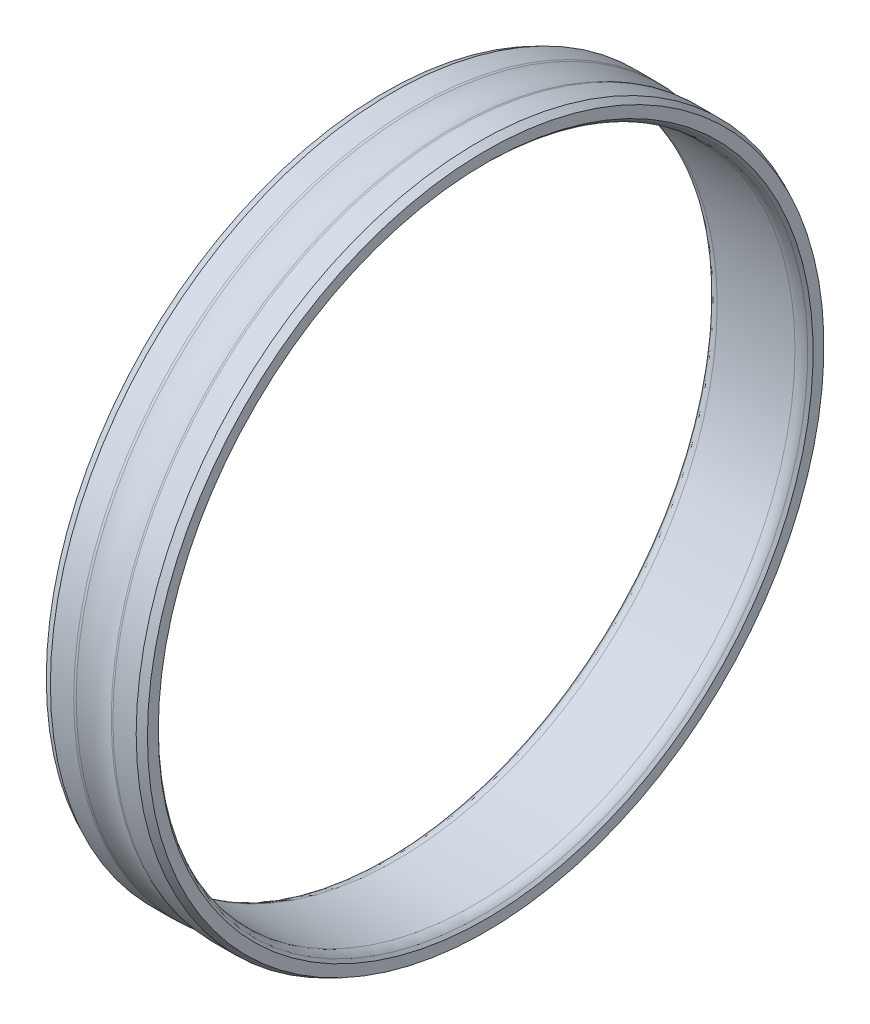
ISO-10303-21;
HEADER;
FILE_DESCRIPTION(('STEP AP214'),'2;1');
FILE_NAME('part.step','',(''),(''),'','','');
FILE_SCHEMA(('AUTOMOTIVE_DESIGN { 1 0 10303 214 1 1 1 1 }'));
ENDSEC;
DATA;
#1=APPLICATION_CONTEXT('core data for automotive mechanical design processes');
#2=APPLICATION_PROTOCOL_DEFINITION('international standard','automotive_design',2000,#1);
#3=PRODUCT_CONTEXT('',#1,'mechanical');
#4=PRODUCT('Part','Part','',(#3));
#5=PRODUCT_RELATED_PRODUCT_CATEGORY('part','',(#4));
#6=PRODUCT_DEFINITION_FORMATION('','',#4);
#7=PRODUCT_DEFINITION_CONTEXT('part definition',#1,'design');
#8=PRODUCT_DEFINITION('design','',#6,#7);
#9=PRODUCT_DEFINITION_SHAPE('','',#8);
#10=(LENGTH_UNIT() NAMED_UNIT(*) SI_UNIT(.MILLI.,.METRE.));
#11=(NAMED_UNIT(*) PLANE_ANGLE_UNIT() SI_UNIT($,.RADIAN.));
#12=(NAMED_UNIT(*) SI_UNIT($,.STERADIAN.) SOLID_ANGLE_UNIT());
#13=UNCERTAINTY_MEASURE_WITH_UNIT(LENGTH_MEASURE(1.E-05),#10,'distance_accuracy_value','');
#14=(GEOMETRIC_REPRESENTATION_CONTEXT(3) GLOBAL_UNCERTAINTY_ASSIGNED_CONTEXT((#13)) GLOBAL_UNIT_ASSIGNED_CONTEXT((#10,
#11,#12)) REPRESENTATION_CONTEXT('',''));
#15=CARTESIAN_POINT('',(0.,0.,0.));
#16=DIRECTION('',(0.,0.,1.));
#17=DIRECTION('',(1.,0.,0.));
#18=AXIS2_PLACEMENT_3D('',#15,#16,#17);
#19=CARTESIAN_POINT('',(1.51789321881345,0.,0.));
#20=DIRECTION('',(-1.,0.,0.));
#21=DIRECTION('',(0.,0.,1.));
#22=AXIS2_PLACEMENT_3D('',#19,#20,#21);
#23=TOROIDAL_SURFACE('',#22,13.035,0.5);
#24=CARTESIAN_POINT('',(1.87144660940672,0.,0.));
#25=DIRECTION('',(-1.,0.,0.));
#26=DIRECTION('',(0.,0.,1.));
#27=AXIS2_PLACEMENT_3D('',#24,#25,#26);
#28=CIRCLE('',#27,12.6814466094067);
#29=CARTESIAN_POINT('',(1.87144660940672,0.,12.6814466094067));
#30=VERTEX_POINT('',#29);
#31=EDGE_CURVE('E11',#30,#30,#28,.T.);
#32=ORIENTED_EDGE('',*,*,#31,.F.);
#33=EDGE_LOOP('',(#32));
#34=FACE_BOUND('',#33,.T.);
#35=CARTESIAN_POINT('',(1.51789321881345,0.,0.));
#36=DIRECTION('',(-1.,0.,0.));
#37=DIRECTION('',(0.,0.,1.));
#38=AXIS2_PLACEMENT_3D('',#35,#36,#37);
#39=CIRCLE('',#38,12.535);
#40=CARTESIAN_POINT('',(1.51789321881345,0.,12.535));
#41=VERTEX_POINT('',#40);
#42=EDGE_CURVE('E122',#41,#41,#39,.T.);
#43=ORIENTED_EDGE('',*,*,#42,.T.);
#44=EDGE_LOOP('',(#43));
#45=FACE_BOUND('',#44,.T.);
#46=ADVANCED_FACE('F16',(#34,#45),#23,.T.);
#47=CARTESIAN_POINT('',(1.975,0.,0.));
#48=DIRECTION('',(1.,0.,0.));
#49=DIRECTION('',(0.,0.,-1.));
#50=AXIS2_PLACEMENT_3D('',#47,#48,#49);
#51=CONICAL_SURFACE('',#50,12.785,0.7853981625);
#52=CARTESIAN_POINT('',(1.975,0.,0.));
#53=DIRECTION('',(-1.,0.,0.));
#54=DIRECTION('',(0.,0.,1.));
#55=AXIS2_PLACEMENT_3D('',#52,#53,#54);
#56=CIRCLE('',#55,12.785);
#57=CARTESIAN_POINT('',(1.975,0.,12.785));
#58=VERTEX_POINT('',#57);
#59=EDGE_CURVE('E26',#58,#58,#56,.T.);
#60=ORIENTED_EDGE('',*,*,#59,.F.);
#61=EDGE_LOOP('',(#60));
#62=FACE_BOUND('',#61,.T.);
#63=ORIENTED_EDGE('',*,*,#31,.T.);
#64=EDGE_LOOP('',(#63));
#65=FACE_BOUND('',#64,.T.);
#66=ADVANCED_FACE('F155',(#62,#65),#51,.F.);
#67=CARTESIAN_POINT('',(1.975,13.2076077025535,0.));
#68=DIRECTION('',(1.,0.,0.));
#69=DIRECTION('',(0.,1.,0.));
#70=AXIS2_PLACEMENT_3D('',#67,#68,#69);
#71=PLANE('',#70);
#72=CARTESIAN_POINT('',(1.975,0.,0.));
#73=DIRECTION('',(-1.,0.,0.));
#74=DIRECTION('',(0.,0.,1.));
#75=AXIS2_PLACEMENT_3D('',#72,#73,#74);
#76=CIRCLE('',#75,13.2076077025535);
#77=CARTESIAN_POINT('',(1.975,0.,13.2076077025535));
#78=VERTEX_POINT('',#77);
#79=EDGE_CURVE('E70',#78,#78,#76,.T.);
#80=ORIENTED_EDGE('',*,*,#79,.F.);
#81=EDGE_LOOP('',(#80));
#82=FACE_BOUND('',#81,.T.);
#83=ORIENTED_EDGE('',*,*,#59,.T.);
#84=EDGE_LOOP('',(#83));
#85=FACE_BOUND('',#84,.T.);
#86=ADVANCED_FACE('F161',(#82,#85),#71,.T.);
#87=CARTESIAN_POINT('',(1.675,0.,0.));
#88=DIRECTION('',(-1.,0.,0.));
#89=DIRECTION('',(0.,0.,1.));
#90=AXIS2_PLACEMENT_3D('',#87,#88,#89);
#91=CONICAL_SURFACE('',#90,13.3475,0.4363323125);
#92=CARTESIAN_POINT('',(1.675,0.,0.));
#93=DIRECTION('',(-1.,0.,0.));
#94=DIRECTION('',(0.,0.,1.));
#95=AXIS2_PLACEMENT_3D('',#92,#93,#94);
#96=CIRCLE('',#95,13.3475);
#97=CARTESIAN_POINT('',(1.675,0.,13.3475));
#98=VERTEX_POINT('',#97);
#99=EDGE_CURVE('E79',#98,#98,#96,.T.);
#100=ORIENTED_EDGE('',*,*,#99,.F.);
#101=EDGE_LOOP('',(#100));
#102=FACE_BOUND('',#101,.T.);
#103=ORIENTED_EDGE('',*,*,#79,.T.);
#104=EDGE_LOOP('',(#103));
#105=FACE_BOUND('',#104,.T.);
#106=ADVANCED_FACE('F194',(#102,#105),#91,.T.);
#107=CARTESIAN_POINT('',(0.,0.,0.));
#108=DIRECTION('',(-1.,0.,0.));
#109=DIRECTION('',(0.,0.,1.));
#110=AXIS2_PLACEMENT_3D('',#107,#108,#109);
#111=CYLINDRICAL_SURFACE('',#110,13.3475);
#112=CARTESIAN_POINT('',(0.765881844673183,0.,0.));
#113=DIRECTION('',(-1.,0.,0.));
#114=DIRECTION('',(0.,0.,1.));
#115=AXIS2_PLACEMENT_3D('',#112,#113,#114);
#116=CIRCLE('',#115,13.3475);
#117=CARTESIAN_POINT('',(0.765881844673183,0.,13.3475));
#118=VERTEX_POINT('',#117);
#119=EDGE_CURVE('E105',#118,#118,#116,.T.);
#120=ORIENTED_EDGE('',*,*,#119,.F.);
#121=EDGE_LOOP('',(#120));
#122=FACE_BOUND('',#121,.T.);
#123=ORIENTED_EDGE('',*,*,#99,.T.);
#124=EDGE_LOOP('',(#123));
#125=FACE_BOUND('',#124,.T.);
#126=ADVANCED_FACE('F200',(#122,#125),#111,.T.);
#127=CARTESIAN_POINT('',(0.765881844673183,0.,0.));
#128=DIRECTION('',(-1.,0.,0.));
#129=DIRECTION('',(0.,0.,1.));
#130=AXIS2_PLACEMENT_3D('',#127,#128,#129);
#131=TOROIDAL_SURFACE('',#130,13.1475,0.2);
#132=CARTESIAN_POINT('',(0.683528958146833,0.,0.));
#133=DIRECTION('',(-1.,0.,0.));
#134=DIRECTION('',(0.,0.,1.));
#135=AXIS2_PLACEMENT_3D('',#132,#133,#134);
#136=CIRCLE('',#135,13.3297580645151);
#137=CARTESIAN_POINT('',(0.683528958146833,0.,13.3297580645151));
#138=VERTEX_POINT('',#137);
#139=EDGE_CURVE('E99',#138,#138,#136,.T.);
#140=ORIENTED_EDGE('',*,*,#139,.F.);
#141=EDGE_LOOP('',(#140));
#142=FACE_BOUND('',#141,.T.);
#143=ORIENTED_EDGE('',*,*,#119,.T.);
#144=EDGE_LOOP('',(#143));
#145=FACE_BOUND('',#144,.T.);
#146=ADVANCED_FACE('F18',(#142,#145),#131,.T.);
#147=CARTESIAN_POINT('',(0.,0.,0.));
#148=DIRECTION('',(-1.,0.,0.));
#149=DIRECTION('',(0.,0.,1.));
#150=AXIS2_PLACEMENT_3D('',#147,#148,#149);
#151=TOROIDAL_SURFACE('',#150,14.8425,1.66);
#152=CARTESIAN_POINT('',(-0.683528958149185,0.,0.));
#153=DIRECTION('',(-1.,0.,0.));
#154=DIRECTION('',(0.,0.,1.));
#155=AXIS2_PLACEMENT_3D('',#152,#153,#154);
#156=CIRCLE('',#155,13.3297580645161);
#157=CARTESIAN_POINT('',(-0.683528958149185,0.,13.3297580645161));
#158=VERTEX_POINT('',#157);
#159=EDGE_CURVE('E93',#158,#158,#156,.T.);
#160=ORIENTED_EDGE('',*,*,#159,.F.);
#161=EDGE_LOOP('',(#160));
#162=FACE_BOUND('',#161,.T.);
#163=ORIENTED_EDGE('',*,*,#139,.T.);
#164=EDGE_LOOP('',(#163));
#165=FACE_BOUND('',#164,.T.);
#166=ADVANCED_FACE('F152',(#162,#165),#151,.F.);
#167=CARTESIAN_POINT('',(-0.765881844673183,0.,0.));
#168=DIRECTION('',(-1.,0.,0.));
#169=DIRECTION('',(0.,0.,1.));
#170=AXIS2_PLACEMENT_3D('',#167,#168,#169);
#171=TOROIDAL_SURFACE('',#170,13.1475,0.2);
#172=CARTESIAN_POINT('',(-0.765881844673183,0.,0.));
#173=DIRECTION('',(-1.,0.,0.));
#174=DIRECTION('',(0.,0.,1.));
#175=AXIS2_PLACEMENT_3D('',#172,#173,#174);
#176=CIRCLE('',#175,13.3475);
#177=CARTESIAN_POINT('',(-0.765881844673183,0.,13.3475));
#178=VERTEX_POINT('',#177);
#179=EDGE_CURVE('E88',#178,#178,#176,.T.);
#180=ORIENTED_EDGE('',*,*,#179,.F.);
#181=EDGE_LOOP('',(#180));
#182=FACE_BOUND('',#181,.T.);
#183=ORIENTED_EDGE('',*,*,#159,.T.);
#184=EDGE_LOOP('',(#183));
#185=FACE_BOUND('',#184,.T.);
#186=ADVANCED_FACE('F145',(#182,#185),#171,.T.);
#187=CARTESIAN_POINT('',(0.,0.,0.));
#188=DIRECTION('',(-1.,0.,0.));
#189=DIRECTION('',(0.,0.,1.));
#190=AXIS2_PLACEMENT_3D('',#187,#188,#189);
#191=CYLINDRICAL_SURFACE('',#190,13.3475);
#192=ORIENTED_EDGE('',*,*,#179,.T.);
#193=EDGE_LOOP('',(#192));
#194=FACE_BOUND('',#193,.T.);
#195=CARTESIAN_POINT('',(-1.675,0.,0.));
#196=DIRECTION('',(-1.,0.,0.));
#197=DIRECTION('',(0.,0.,-1.));
#198=AXIS2_PLACEMENT_3D('',#195,#196,#197);
#199=CIRCLE('',#198,13.3475);
#200=CARTESIAN_POINT('',(-1.675,0.,-13.3475));
#201=VERTEX_POINT('',#200);
#202=EDGE_CURVE('E94',#201,#201,#199,.T.);
#203=ORIENTED_EDGE('',*,*,#202,.F.);
#204=EDGE_LOOP('',(#203));
#205=FACE_BOUND('',#204,.T.);
#206=ADVANCED_FACE('F89',(#194,#205),#191,.T.);
#207=CARTESIAN_POINT('',(-1.975,0.,0.));
#208=DIRECTION('',(1.,0.,0.));
#209=DIRECTION('',(0.,0.,-1.));
#210=AXIS2_PLACEMENT_3D('',#207,#208,#209);
#211=CONICAL_SURFACE('',#210,13.2076077025535,0.436332312499998);
#212=CARTESIAN_POINT('',(-1.975,0.,0.));
#213=DIRECTION('',(-1.,0.,0.));
#214=DIRECTION('',(0.,0.,1.));
#215=AXIS2_PLACEMENT_3D('',#212,#213,#214);
#216=CIRCLE('',#215,13.2076077025535);
#217=CARTESIAN_POINT('',(-1.975,0.,13.2076077025535));
#218=VERTEX_POINT('',#217);
#219=EDGE_CURVE('E102',#218,#218,#216,.T.);
#220=ORIENTED_EDGE('',*,*,#219,.F.);
#221=EDGE_LOOP('',(#220));
#222=FACE_BOUND('',#221,.T.);
#223=ORIENTED_EDGE('',*,*,#202,.T.);
#224=EDGE_LOOP('',(#223));
#225=FACE_BOUND('',#224,.T.);
#226=ADVANCED_FACE('F139',(#222,#225),#211,.T.);
#227=CARTESIAN_POINT('',(-1.975,12.785,0.));
#228=DIRECTION('',(-1.,0.,0.));
#229=DIRECTION('',(0.,0.,1.));
#230=AXIS2_PLACEMENT_3D('',#227,#228,#229);
#231=PLANE('',#230);
#232=CARTESIAN_POINT('',(-1.975,0.,0.));
#233=DIRECTION('',(-1.,0.,0.));
#234=DIRECTION('',(0.,0.,1.));
#235=AXIS2_PLACEMENT_3D('',#232,#233,#234);
#236=CIRCLE('',#235,12.785);
#237=CARTESIAN_POINT('',(-1.975,0.,12.785));
#238=VERTEX_POINT('',#237);
#239=EDGE_CURVE('E130',#238,#238,#236,.T.);
#240=ORIENTED_EDGE('',*,*,#239,.F.);
#241=EDGE_LOOP('',(#240));
#242=FACE_BOUND('',#241,.T.);
#243=ORIENTED_EDGE('',*,*,#219,.T.);
#244=EDGE_LOOP('',(#243));
#245=FACE_BOUND('',#244,.T.);
#246=ADVANCED_FACE('F137',(#242,#245),#231,.T.);
#247=CARTESIAN_POINT('',(-1.87144660940672,0.,0.));
#248=DIRECTION('',(-1.,0.,0.));
#249=DIRECTION('',(0.,0.,1.));
#250=AXIS2_PLACEMENT_3D('',#247,#248,#249);
#251=CONICAL_SURFACE('',#250,12.6814466094067,0.785398162500002);
#252=CARTESIAN_POINT('',(-1.87144660940672,0.,0.));
#253=DIRECTION('',(-1.,0.,0.));
#254=DIRECTION('',(0.,0.,1.));
#255=AXIS2_PLACEMENT_3D('',#252,#253,#254);
#256=CIRCLE('',#255,12.6814466094067);
#257=CARTESIAN_POINT('',(-1.87144660940672,0.,12.6814466094067));
#258=VERTEX_POINT('',#257);
#259=EDGE_CURVE('E126',#258,#258,#256,.T.);
#260=ORIENTED_EDGE('',*,*,#259,.F.);
#261=EDGE_LOOP('',(#260));
#262=FACE_BOUND('',#261,.T.);
#263=ORIENTED_EDGE('',*,*,#239,.T.);
#264=EDGE_LOOP('',(#263));
#265=FACE_BOUND('',#264,.T.);
#266=ADVANCED_FACE('F178',(#262,#265),#251,.F.);
#267=CARTESIAN_POINT('',(-1.51789321881345,0.,0.));
#268=DIRECTION('',(-1.,0.,0.));
#269=DIRECTION('',(0.,0.,1.));
#270=AXIS2_PLACEMENT_3D('',#267,#268,#269);
#271=TOROIDAL_SURFACE('',#270,13.035,0.5);
#272=CARTESIAN_POINT('',(-1.51789321881345,0.,0.));
#273=DIRECTION('',(-1.,0.,0.));
#274=DIRECTION('',(0.,0.,1.));
#275=AXIS2_PLACEMENT_3D('',#272,#273,#274);
#276=CIRCLE('',#275,12.535);
#277=CARTESIAN_POINT('',(-1.51789321881345,0.,12.535));
#278=VERTEX_POINT('',#277);
#279=EDGE_CURVE('E119',#278,#278,#276,.T.);
#280=ORIENTED_EDGE('',*,*,#279,.F.);
#281=EDGE_LOOP('',(#280));
#282=FACE_BOUND('',#281,.T.);
#283=ORIENTED_EDGE('',*,*,#259,.T.);
#284=EDGE_LOOP('',(#283));
#285=FACE_BOUND('',#284,.T.);
#286=ADVANCED_FACE('F171',(#282,#285),#271,.T.);
#287=CARTESIAN_POINT('',(0.,0.,0.));
#288=DIRECTION('',(-1.,0.,0.));
#289=DIRECTION('',(0.,0.,1.));
#290=AXIS2_PLACEMENT_3D('',#287,#288,#289);
#291=CYLINDRICAL_SURFACE('',#290,12.535);
#292=ORIENTED_EDGE('',*,*,#42,.F.);
#293=EDGE_LOOP('',(#292));
#294=FACE_BOUND('',#293,.T.);
#295=ORIENTED_EDGE('',*,*,#279,.T.);
#296=EDGE_LOOP('',(#295));
#297=FACE_BOUND('',#296,.T.);
#298=ADVANCED_FACE('F168',(#294,#297),#291,.F.);
#299=CLOSED_SHELL('',(#46,#66,#86,#106,#126,#146,#166,#186,#206,#226,#246,#266,#286,#298));
#300=MANIFOLD_SOLID_BREP('B1',#299);
#301=ADVANCED_BREP_SHAPE_REPRESENTATION('',(#18,#300),#14);
#302=SHAPE_DEFINITION_REPRESENTATION(#9,#301);
ENDSEC;
END-ISO-10303-21;
